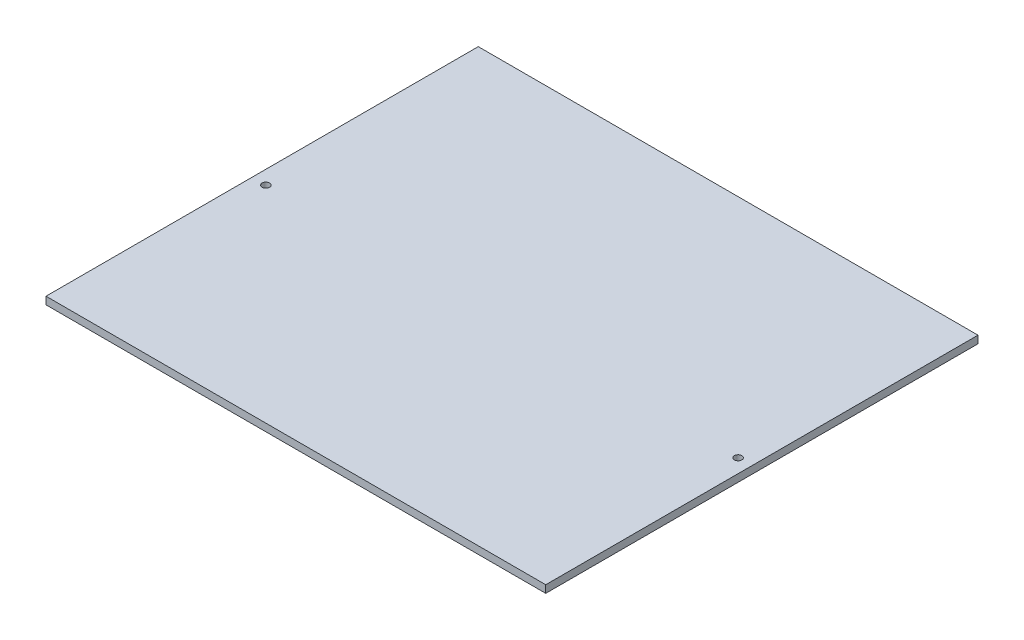
ISO-10303-21;
HEADER;
FILE_DESCRIPTION(('STEP AP214'),'2;1');
FILE_NAME('part.step','',(''),(''),'','','');
FILE_SCHEMA(('AUTOMOTIVE_DESIGN { 1 0 10303 214 1 1 1 1 }'));
ENDSEC;
DATA;
#1=APPLICATION_CONTEXT('core data for automotive mechanical design processes');
#2=APPLICATION_PROTOCOL_DEFINITION('international standard','automotive_design',2000,#1);
#3=PRODUCT_CONTEXT('',#1,'mechanical');
#4=PRODUCT('Part','Part','',(#3));
#5=PRODUCT_RELATED_PRODUCT_CATEGORY('part','',(#4));
#6=PRODUCT_DEFINITION_FORMATION('','',#4);
#7=PRODUCT_DEFINITION_CONTEXT('part definition',#1,'design');
#8=PRODUCT_DEFINITION('design','',#6,#7);
#9=PRODUCT_DEFINITION_SHAPE('','',#8);
#10=(LENGTH_UNIT() NAMED_UNIT(*) SI_UNIT(.MILLI.,.METRE.));
#11=(NAMED_UNIT(*) PLANE_ANGLE_UNIT() SI_UNIT($,.RADIAN.));
#12=(NAMED_UNIT(*) SI_UNIT($,.STERADIAN.) SOLID_ANGLE_UNIT());
#13=UNCERTAINTY_MEASURE_WITH_UNIT(LENGTH_MEASURE(1.E-05),#10,'distance_accuracy_value','');
#14=(GEOMETRIC_REPRESENTATION_CONTEXT(3) GLOBAL_UNCERTAINTY_ASSIGNED_CONTEXT((#13)) GLOBAL_UNIT_ASSIGNED_CONTEXT((#10,
#11,#12)) REPRESENTATION_CONTEXT('',''));
#15=CARTESIAN_POINT('',(0.,0.,0.));
#16=DIRECTION('',(0.,0.,1.));
#17=DIRECTION('',(1.,0.,0.));
#18=AXIS2_PLACEMENT_3D('',#15,#16,#17);
#19=CARTESIAN_POINT('',(100.,3.,-86.5));
#20=DIRECTION('',(-1.,0.,0.));
#21=DIRECTION('',(0.,0.,1.));
#22=AXIS2_PLACEMENT_3D('',#19,#20,#21);
#23=PLANE('',#22);
#24=DIRECTION('',(0.,0.,-1.));
#25=VECTOR('',#24,1.);
#26=CARTESIAN_POINT('',(100.,0.,-86.5));
#27=LINE('',#26,#25);
#28=CARTESIAN_POINT('',(100.,0.,86.5));
#29=VERTEX_POINT('',#28);
#30=CARTESIAN_POINT('',(100.,0.,-86.5));
#31=VERTEX_POINT('',#30);
#32=EDGE_CURVE('E107',#29,#31,#27,.T.);
#33=ORIENTED_EDGE('',*,*,#32,.T.);
#34=DIRECTION('',(0.,-1.,0.));
#35=VECTOR('',#34,1.);
#36=CARTESIAN_POINT('',(100.,3.,-86.5));
#37=LINE('',#36,#35);
#38=CARTESIAN_POINT('',(100.,3.,-86.5));
#39=VERTEX_POINT('',#38);
#40=EDGE_CURVE('E11',#39,#31,#37,.T.);
#41=ORIENTED_EDGE('',*,*,#40,.F.);
#42=DIRECTION('',(0.,0.,-1.));
#43=VECTOR('',#42,1.);
#44=CARTESIAN_POINT('',(100.,3.,-86.5));
#45=LINE('',#44,#43);
#46=CARTESIAN_POINT('',(100.,3.,86.5));
#47=VERTEX_POINT('',#46);
#48=EDGE_CURVE('E91',#47,#39,#45,.T.);
#49=ORIENTED_EDGE('',*,*,#48,.F.);
#50=DIRECTION('',(0.,-1.,0.));
#51=VECTOR('',#50,1.);
#52=CARTESIAN_POINT('',(100.,3.,86.5));
#53=LINE('',#52,#51);
#54=EDGE_CURVE('E103',#47,#29,#53,.T.);
#55=ORIENTED_EDGE('',*,*,#54,.T.);
#56=EDGE_LOOP('',(#33,#41,#49,#55));
#57=FACE_BOUND('',#56,.T.);
#58=ADVANCED_FACE('F39',(#57),#23,.F.);
#59=CARTESIAN_POINT('',(-100.,3.,-86.5));
#60=DIRECTION('',(0.,0.,1.));
#61=DIRECTION('',(1.,0.,0.));
#62=AXIS2_PLACEMENT_3D('',#59,#60,#61);
#63=PLANE('',#62);
#64=DIRECTION('',(-1.,0.,0.));
#65=VECTOR('',#64,1.);
#66=CARTESIAN_POINT('',(-100.,0.,-86.5));
#67=LINE('',#66,#65);
#68=CARTESIAN_POINT('',(-100.,0.,-86.5));
#69=VERTEX_POINT('',#68);
#70=EDGE_CURVE('E96',#31,#69,#67,.T.);
#71=ORIENTED_EDGE('',*,*,#70,.T.);
#72=DIRECTION('',(0.,-1.,0.));
#73=VECTOR('',#72,1.);
#74=CARTESIAN_POINT('',(-100.,3.,-86.5));
#75=LINE('',#74,#73);
#76=CARTESIAN_POINT('',(-100.,3.,-86.5));
#77=VERTEX_POINT('',#76);
#78=EDGE_CURVE('E48',#77,#69,#75,.T.);
#79=ORIENTED_EDGE('',*,*,#78,.F.);
#80=DIRECTION('',(-1.,0.,0.));
#81=VECTOR('',#80,1.);
#82=CARTESIAN_POINT('',(-100.,3.,-86.5));
#83=LINE('',#82,#81);
#84=EDGE_CURVE('E86',#39,#77,#83,.T.);
#85=ORIENTED_EDGE('',*,*,#84,.F.);
#86=ORIENTED_EDGE('',*,*,#40,.T.);
#87=EDGE_LOOP('',(#71,#79,#85,#86));
#88=FACE_BOUND('',#87,.T.);
#89=ADVANCED_FACE('F95',(#88),#63,.F.);
#90=CARTESIAN_POINT('',(-100.,3.,-86.5));
#91=DIRECTION('',(1.,0.,0.));
#92=DIRECTION('',(0.,0.,-1.));
#93=AXIS2_PLACEMENT_3D('',#90,#91,#92);
#94=PLANE('',#93);
#95=DIRECTION('',(0.,0.,1.));
#96=VECTOR('',#95,1.);
#97=CARTESIAN_POINT('',(-100.,0.,-86.5));
#98=LINE('',#97,#96);
#99=CARTESIAN_POINT('',(-100.,0.,86.5));
#100=VERTEX_POINT('',#99);
#101=EDGE_CURVE('E73',#69,#100,#98,.T.);
#102=ORIENTED_EDGE('',*,*,#101,.T.);
#103=DIRECTION('',(0.,-1.,0.));
#104=VECTOR('',#103,1.);
#105=CARTESIAN_POINT('',(-100.,3.,86.5));
#106=LINE('',#105,#104);
#107=CARTESIAN_POINT('',(-100.,3.,86.5));
#108=VERTEX_POINT('',#107);
#109=EDGE_CURVE('E98',#108,#100,#106,.T.);
#110=ORIENTED_EDGE('',*,*,#109,.F.);
#111=DIRECTION('',(0.,0.,1.));
#112=VECTOR('',#111,1.);
#113=CARTESIAN_POINT('',(-100.,3.,-86.5));
#114=LINE('',#113,#112);
#115=EDGE_CURVE('E89',#77,#108,#114,.T.);
#116=ORIENTED_EDGE('',*,*,#115,.F.);
#117=ORIENTED_EDGE('',*,*,#78,.T.);
#118=EDGE_LOOP('',(#102,#110,#116,#117));
#119=FACE_BOUND('',#118,.T.);
#120=ADVANCED_FACE('F99',(#119),#94,.F.);
#121=CARTESIAN_POINT('',(-100.,3.,86.5));
#122=DIRECTION('',(0.,0.,-1.));
#123=DIRECTION('',(-1.,0.,0.));
#124=AXIS2_PLACEMENT_3D('',#121,#122,#123);
#125=PLANE('',#124);
#126=DIRECTION('',(1.,0.,0.));
#127=VECTOR('',#126,1.);
#128=CARTESIAN_POINT('',(-100.,0.,86.5));
#129=LINE('',#128,#127);
#130=EDGE_CURVE('E79',#100,#29,#129,.T.);
#131=ORIENTED_EDGE('',*,*,#130,.T.);
#132=ORIENTED_EDGE('',*,*,#54,.F.);
#133=DIRECTION('',(1.,0.,0.));
#134=VECTOR('',#133,1.);
#135=CARTESIAN_POINT('',(-100.,3.,86.5));
#136=LINE('',#135,#134);
#137=EDGE_CURVE('E56',#108,#47,#136,.T.);
#138=ORIENTED_EDGE('',*,*,#137,.F.);
#139=ORIENTED_EDGE('',*,*,#109,.T.);
#140=EDGE_LOOP('',(#131,#132,#138,#139));
#141=FACE_BOUND('',#140,.T.);
#142=ADVANCED_FACE('F121',(#141),#125,.F.);
#143=CARTESIAN_POINT('',(0.,3.,0.));
#144=DIRECTION('',(0.,1.,0.));
#145=DIRECTION('',(0.,0.,1.));
#146=AXIS2_PLACEMENT_3D('',#143,#144,#145);
#147=PLANE('',#146);
#148=CARTESIAN_POINT('',(94.5,3.,4.00000000000002));
#149=DIRECTION('',(0.,1.,0.));
#150=DIRECTION('',(0.,0.,1.));
#151=AXIS2_PLACEMENT_3D('',#148,#149,#150);
#152=CIRCLE('',#151,1.5);
#153=CARTESIAN_POINT('',(94.5,3.,5.50000000000001));
#154=VERTEX_POINT('',#153);
#155=EDGE_CURVE('E136',#154,#154,#152,.T.);
#156=ORIENTED_EDGE('',*,*,#155,.F.);
#157=EDGE_LOOP('',(#156));
#158=FACE_BOUND('',#157,.T.);
#159=CARTESIAN_POINT('',(-94.5,3.,4.00000000000002));
#160=DIRECTION('',(0.,1.,0.));
#161=DIRECTION('',(0.,0.,-1.));
#162=AXIS2_PLACEMENT_3D('',#159,#160,#161);
#163=CIRCLE('',#162,1.5);
#164=CARTESIAN_POINT('',(-94.5,3.,2.50000000000002));
#165=VERTEX_POINT('',#164);
#166=EDGE_CURVE('E128',#165,#165,#163,.T.);
#167=ORIENTED_EDGE('',*,*,#166,.F.);
#168=EDGE_LOOP('',(#167));
#169=FACE_BOUND('',#168,.T.);
#170=ORIENTED_EDGE('',*,*,#48,.T.);
#171=ORIENTED_EDGE('',*,*,#84,.T.);
#172=ORIENTED_EDGE('',*,*,#115,.T.);
#173=ORIENTED_EDGE('',*,*,#137,.T.);
#174=EDGE_LOOP('',(#170,#171,#172,#173));
#175=FACE_BOUND('',#174,.T.);
#176=ADVANCED_FACE('F87',(#158,#169,#175),#147,.T.);
#177=CARTESIAN_POINT('',(0.,0.,0.));
#178=DIRECTION('',(0.,1.,0.));
#179=DIRECTION('',(0.,0.,1.));
#180=AXIS2_PLACEMENT_3D('',#177,#178,#179);
#181=PLANE('',#180);
#182=CARTESIAN_POINT('',(94.5,0.,4.00000000000002));
#183=DIRECTION('',(0.,1.,0.));
#184=DIRECTION('',(0.,0.,1.));
#185=AXIS2_PLACEMENT_3D('',#182,#183,#184);
#186=CIRCLE('',#185,1.5);
#187=CARTESIAN_POINT('',(94.5,0.,5.50000000000001));
#188=VERTEX_POINT('',#187);
#189=EDGE_CURVE('E111',#188,#188,#186,.T.);
#190=ORIENTED_EDGE('',*,*,#189,.T.);
#191=EDGE_LOOP('',(#190));
#192=FACE_BOUND('',#191,.T.);
#193=CARTESIAN_POINT('',(-94.5,0.,4.00000000000002));
#194=DIRECTION('',(0.,1.,0.));
#195=DIRECTION('',(0.,0.,-1.));
#196=AXIS2_PLACEMENT_3D('',#193,#194,#195);
#197=CIRCLE('',#196,1.5);
#198=CARTESIAN_POINT('',(-94.5,0.,2.50000000000002));
#199=VERTEX_POINT('',#198);
#200=EDGE_CURVE('E132',#199,#199,#197,.T.);
#201=ORIENTED_EDGE('',*,*,#200,.T.);
#202=EDGE_LOOP('',(#201));
#203=FACE_BOUND('',#202,.T.);
#204=ORIENTED_EDGE('',*,*,#32,.F.);
#205=ORIENTED_EDGE('',*,*,#130,.F.);
#206=ORIENTED_EDGE('',*,*,#101,.F.);
#207=ORIENTED_EDGE('',*,*,#70,.F.);
#208=EDGE_LOOP('',(#204,#205,#206,#207));
#209=FACE_BOUND('',#208,.T.);
#210=ADVANCED_FACE('F124',(#192,#203,#209),#181,.F.);
#211=CARTESIAN_POINT('',(-94.5,0.,4.00000000000002));
#212=DIRECTION('',(0.,1.,0.));
#213=DIRECTION('',(0.,0.,1.));
#214=AXIS2_PLACEMENT_3D('',#211,#212,#213);
#215=CYLINDRICAL_SURFACE('',#214,1.5);
#216=ORIENTED_EDGE('',*,*,#200,.F.);
#217=EDGE_LOOP('',(#216));
#218=FACE_BOUND('',#217,.T.);
#219=ORIENTED_EDGE('',*,*,#166,.T.);
#220=EDGE_LOOP('',(#219));
#221=FACE_BOUND('',#220,.T.);
#222=ADVANCED_FACE('F149',(#218,#221),#215,.F.);
#223=CARTESIAN_POINT('',(94.5,0.,4.00000000000002));
#224=DIRECTION('',(0.,1.,0.));
#225=DIRECTION('',(0.,0.,1.));
#226=AXIS2_PLACEMENT_3D('',#223,#224,#225);
#227=CYLINDRICAL_SURFACE('',#226,1.5);
#228=ORIENTED_EDGE('',*,*,#189,.F.);
#229=EDGE_LOOP('',(#228));
#230=FACE_BOUND('',#229,.T.);
#231=ORIENTED_EDGE('',*,*,#155,.T.);
#232=EDGE_LOOP('',(#231));
#233=FACE_BOUND('',#232,.T.);
#234=ADVANCED_FACE('F146',(#230,#233),#227,.F.);
#235=CLOSED_SHELL('',(#58,#89,#120,#142,#176,#210,#222,#234));
#236=MANIFOLD_SOLID_BREP('B2',#235);
#237=ADVANCED_BREP_SHAPE_REPRESENTATION('',(#18,#236),#14);
#238=SHAPE_DEFINITION_REPRESENTATION(#9,#237);
ENDSEC;
END-ISO-10303-21;
